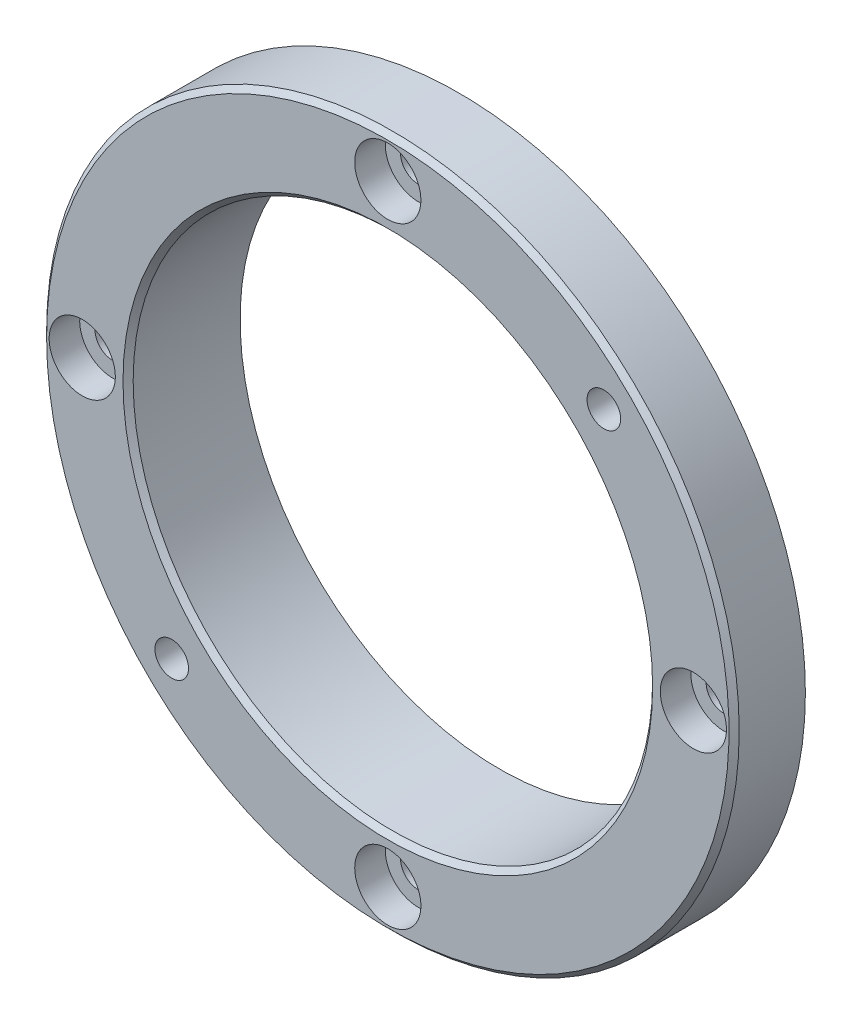
ISO-10303-21;
HEADER;
FILE_DESCRIPTION(('STEP AP214'),'2;1');
FILE_NAME('part.step','',(''),(''),'','','');
FILE_SCHEMA(('AUTOMOTIVE_DESIGN { 1 0 10303 214 1 1 1 1 }'));
ENDSEC;
DATA;
#1=APPLICATION_CONTEXT('core data for automotive mechanical design processes');
#2=APPLICATION_PROTOCOL_DEFINITION('international standard','automotive_design',2000,#1);
#3=PRODUCT_CONTEXT('',#1,'mechanical');
#4=PRODUCT('Part','Part','',(#3));
#5=PRODUCT_RELATED_PRODUCT_CATEGORY('part','',(#4));
#6=PRODUCT_DEFINITION_FORMATION('','',#4);
#7=PRODUCT_DEFINITION_CONTEXT('part definition',#1,'design');
#8=PRODUCT_DEFINITION('design','',#6,#7);
#9=PRODUCT_DEFINITION_SHAPE('','',#8);
#10=(LENGTH_UNIT() NAMED_UNIT(*) SI_UNIT(.MILLI.,.METRE.));
#11=(NAMED_UNIT(*) PLANE_ANGLE_UNIT() SI_UNIT($,.RADIAN.));
#12=(NAMED_UNIT(*) SI_UNIT($,.STERADIAN.) SOLID_ANGLE_UNIT());
#13=UNCERTAINTY_MEASURE_WITH_UNIT(LENGTH_MEASURE(1.E-05),#10,'distance_accuracy_value','');
#14=(GEOMETRIC_REPRESENTATION_CONTEXT(3) GLOBAL_UNCERTAINTY_ASSIGNED_CONTEXT((#13)) GLOBAL_UNIT_ASSIGNED_CONTEXT((#10,
#11,#12)) REPRESENTATION_CONTEXT('',''));
#15=CARTESIAN_POINT('',(0.,0.,0.));
#16=DIRECTION('',(0.,0.,1.));
#17=DIRECTION('',(1.,0.,0.));
#18=AXIS2_PLACEMENT_3D('',#15,#16,#17);
#19=CARTESIAN_POINT('',(0.,0.,0.));
#20=DIRECTION('',(0.,0.,1.));
#21=DIRECTION('',(1.,0.,0.));
#22=AXIS2_PLACEMENT_3D('',#19,#20,#21);
#23=CYLINDRICAL_SURFACE('',#22,27.);
#24=CARTESIAN_POINT('',(0.,0.,-10.5));
#25=DIRECTION('',(0.,0.,1.));
#26=DIRECTION('',(1.,0.,0.));
#27=AXIS2_PLACEMENT_3D('',#24,#25,#26);
#28=CIRCLE('',#27,27.);
#29=CARTESIAN_POINT('',(27.,0.,-10.5));
#30=VERTEX_POINT('',#29);
#31=EDGE_CURVE('E51',#30,#30,#28,.T.);
#32=ORIENTED_EDGE('',*,*,#31,.T.);
#33=EDGE_LOOP('',(#32));
#34=FACE_BOUND('',#33,.T.);
#35=CARTESIAN_POINT('',(0.,0.,-7.));
#36=DIRECTION('',(0.,0.,1.));
#37=DIRECTION('',(1.,0.,0.));
#38=AXIS2_PLACEMENT_3D('',#35,#36,#37);
#39=CIRCLE('',#38,27.);
#40=CARTESIAN_POINT('',(27.,0.,-7.));
#41=VERTEX_POINT('',#40);
#42=EDGE_CURVE('E60',#41,#41,#39,.T.);
#43=ORIENTED_EDGE('',*,*,#42,.F.);
#44=EDGE_LOOP('',(#43));
#45=FACE_BOUND('',#44,.T.);
#46=ADVANCED_FACE('F28',(#34,#45),#23,.T.);
#47=CARTESIAN_POINT('',(0.,27.,-11.));
#48=DIRECTION('',(0.,0.,1.));
#49=DIRECTION('',(1.,0.,0.));
#50=AXIS2_PLACEMENT_3D('',#47,#48,#49);
#51=PLANE('',#50);
#52=CARTESIAN_POINT('',(0.,0.,-11.));
#53=DIRECTION('',(0.,0.,1.));
#54=DIRECTION('',(1.,0.,0.));
#55=AXIS2_PLACEMENT_3D('',#52,#53,#54);
#56=CIRCLE('',#55,26.5);
#57=CARTESIAN_POINT('',(26.5,0.,-11.));
#58=VERTEX_POINT('',#57);
#59=EDGE_CURVE('E48',#58,#58,#56,.F.);
#60=ORIENTED_EDGE('',*,*,#59,.T.);
#61=EDGE_LOOP('',(#60));
#62=FACE_BOUND('',#61,.T.);
#63=CARTESIAN_POINT('',(0.,0.,-11.));
#64=DIRECTION('',(0.,0.,1.));
#65=DIRECTION('',(1.,0.,0.));
#66=AXIS2_PLACEMENT_3D('',#63,#64,#65);
#67=CIRCLE('',#66,25.5);
#68=CARTESIAN_POINT('',(25.5,0.,-11.));
#69=VERTEX_POINT('',#68);
#70=EDGE_CURVE('E54',#69,#69,#67,.T.);
#71=ORIENTED_EDGE('',*,*,#70,.T.);
#72=EDGE_LOOP('',(#71));
#73=FACE_BOUND('',#72,.T.);
#74=ADVANCED_FACE('F174',(#62,#73),#51,.F.);
#75=CARTESIAN_POINT('',(0.,0.,0.));
#76=DIRECTION('',(0.,0.,1.));
#77=DIRECTION('',(1.,0.,0.));
#78=AXIS2_PLACEMENT_3D('',#75,#76,#77);
#79=CYLINDRICAL_SURFACE('',#78,25.5);
#80=CARTESIAN_POINT('',(0.,0.,-0.500000000000018));
#81=DIRECTION('',(0.,0.,-1.));
#82=DIRECTION('',(-1.,0.,0.));
#83=AXIS2_PLACEMENT_3D('',#80,#81,#82);
#84=CIRCLE('',#83,25.5);
#85=CARTESIAN_POINT('',(-25.5,0.,-0.500000000000018));
#86=VERTEX_POINT('',#85);
#87=EDGE_CURVE('E43',#86,#86,#84,.F.);
#88=ORIENTED_EDGE('',*,*,#87,.T.);
#89=EDGE_LOOP('',(#88));
#90=FACE_BOUND('',#89,.T.);
#91=ORIENTED_EDGE('',*,*,#70,.F.);
#92=EDGE_LOOP('',(#91));
#93=FACE_BOUND('',#92,.T.);
#94=ADVANCED_FACE('F145',(#90,#93),#79,.F.);
#95=CARTESIAN_POINT('',(0.,25.5,0.));
#96=DIRECTION('',(0.,0.,-1.));
#97=DIRECTION('',(-1.,0.,0.));
#98=AXIS2_PLACEMENT_3D('',#95,#96,#97);
#99=PLANE('',#98);
#100=CARTESIAN_POINT('',(0.,0.,0.));
#101=DIRECTION('',(0.,0.,-1.));
#102=DIRECTION('',(-1.,0.,0.));
#103=AXIS2_PLACEMENT_3D('',#100,#101,#102);
#104=CIRCLE('',#103,26.);
#105=CARTESIAN_POINT('',(-26.,0.,0.));
#106=VERTEX_POINT('',#105);
#107=EDGE_CURVE('E35',#106,#106,#104,.T.);
#108=ORIENTED_EDGE('',*,*,#107,.T.);
#109=EDGE_LOOP('',(#108));
#110=FACE_BOUND('',#109,.T.);
#111=CARTESIAN_POINT('',(0.,0.,0.));
#112=DIRECTION('',(0.,0.,-1.));
#113=DIRECTION('',(-1.,0.,0.));
#114=AXIS2_PLACEMENT_3D('',#111,#112,#113);
#115=CIRCLE('',#114,33.5);
#116=CARTESIAN_POINT('',(-33.5,0.,0.));
#117=VERTEX_POINT('',#116);
#118=EDGE_CURVE('E39',#117,#117,#115,.F.);
#119=ORIENTED_EDGE('',*,*,#118,.T.);
#120=EDGE_LOOP('',(#119));
#121=FACE_BOUND('',#120,.T.);
#122=CARTESIAN_POINT('',(30.,3.14233502499844E-13,0.));
#123=DIRECTION('',(0.,0.,1.));
#124=DIRECTION('',(0.,-1.,0.));
#125=AXIS2_PLACEMENT_3D('',#122,#123,#124);
#126=CIRCLE('',#125,3.25);
#127=CARTESIAN_POINT('',(30.,-3.24999999999969,0.));
#128=VERTEX_POINT('',#127);
#129=EDGE_CURVE('E100',#128,#128,#126,.T.);
#130=ORIENTED_EDGE('',*,*,#129,.F.);
#131=EDGE_LOOP('',(#130));
#132=FACE_BOUND('',#131,.T.);
#133=CARTESIAN_POINT('',(2.09489001666563E-13,-30.,0.));
#134=DIRECTION('',(0.,0.,1.));
#135=DIRECTION('',(-1.,0.,0.));
#136=AXIS2_PLACEMENT_3D('',#133,#134,#135);
#137=CIRCLE('',#136,3.25);
#138=CARTESIAN_POINT('',(-3.24999999999979,-30.,0.));
#139=VERTEX_POINT('',#138);
#140=EDGE_CURVE('E94',#139,#139,#137,.T.);
#141=ORIENTED_EDGE('',*,*,#140,.F.);
#142=EDGE_LOOP('',(#141));
#143=FACE_BOUND('',#142,.T.);
#144=CARTESIAN_POINT('',(-30.,-1.04744500833281E-13,0.));
#145=DIRECTION('',(0.,0.,1.));
#146=DIRECTION('',(0.,1.,0.));
#147=AXIS2_PLACEMENT_3D('',#144,#145,#146);
#148=CIRCLE('',#147,3.25);
#149=CARTESIAN_POINT('',(-30.,3.24999999999989,0.));
#150=VERTEX_POINT('',#149);
#151=EDGE_CURVE('E88',#150,#150,#148,.T.);
#152=ORIENTED_EDGE('',*,*,#151,.F.);
#153=EDGE_LOOP('',(#152));
#154=FACE_BOUND('',#153,.T.);
#155=CARTESIAN_POINT('',(0.,30.,0.));
#156=DIRECTION('',(0.,0.,1.));
#157=DIRECTION('',(1.,0.,0.));
#158=AXIS2_PLACEMENT_3D('',#155,#156,#157);
#159=CIRCLE('',#158,3.25);
#160=CARTESIAN_POINT('',(3.25,30.,0.));
#161=VERTEX_POINT('',#160);
#162=EDGE_CURVE('E76',#161,#161,#159,.T.);
#163=ORIENTED_EDGE('',*,*,#162,.F.);
#164=EDGE_LOOP('',(#163));
#165=FACE_BOUND('',#164,.T.);
#166=CARTESIAN_POINT('',(21.2132034355965,21.2132034355963,0.));
#167=DIRECTION('',(0.,0.,1.));
#168=DIRECTION('',(1.,0.,0.));
#169=AXIS2_PLACEMENT_3D('',#166,#167,#168);
#170=CIRCLE('',#169,1.64999999999999);
#171=CARTESIAN_POINT('',(22.8632034355965,21.2132034355963,0.));
#172=VERTEX_POINT('',#171);
#173=EDGE_CURVE('E72',#172,#172,#170,.T.);
#174=ORIENTED_EDGE('',*,*,#173,.F.);
#175=EDGE_LOOP('',(#174));
#176=FACE_BOUND('',#175,.T.);
#177=CARTESIAN_POINT('',(-21.2132034355965,-21.2132034355963,0.));
#178=DIRECTION('',(0.,0.,1.));
#179=DIRECTION('',(1.,0.,0.));
#180=AXIS2_PLACEMENT_3D('',#177,#178,#179);
#181=CIRCLE('',#180,1.64999999999999);
#182=CARTESIAN_POINT('',(-19.5632034355965,-21.2132034355963,0.));
#183=VERTEX_POINT('',#182);
#184=EDGE_CURVE('E66',#183,#183,#181,.T.);
#185=ORIENTED_EDGE('',*,*,#184,.F.);
#186=EDGE_LOOP('',(#185));
#187=FACE_BOUND('',#186,.T.);
#188=ADVANCED_FACE('F141',(#110,#121,#132,#143,#154,#165,#176,#187),#99,.F.);
#189=CARTESIAN_POINT('',(0.,0.,0.));
#190=DIRECTION('',(0.,0.,1.));
#191=DIRECTION('',(1.,0.,0.));
#192=AXIS2_PLACEMENT_3D('',#189,#190,#191);
#193=CYLINDRICAL_SURFACE('',#192,34.);
#194=CARTESIAN_POINT('',(0.,0.,-0.500000000000008));
#195=DIRECTION('',(0.,0.,-1.));
#196=DIRECTION('',(-1.,0.,0.));
#197=AXIS2_PLACEMENT_3D('',#194,#195,#196);
#198=CIRCLE('',#197,34.);
#199=CARTESIAN_POINT('',(-34.,0.,-0.500000000000008));
#200=VERTEX_POINT('',#199);
#201=EDGE_CURVE('E10',#200,#200,#198,.T.);
#202=ORIENTED_EDGE('',*,*,#201,.T.);
#203=EDGE_LOOP('',(#202));
#204=FACE_BOUND('',#203,.T.);
#205=CARTESIAN_POINT('',(0.,0.,-7.));
#206=DIRECTION('',(0.,0.,1.));
#207=DIRECTION('',(1.,0.,0.));
#208=AXIS2_PLACEMENT_3D('',#205,#206,#207);
#209=CIRCLE('',#208,34.);
#210=CARTESIAN_POINT('',(34.,0.,-7.));
#211=VERTEX_POINT('',#210);
#212=EDGE_CURVE('E57',#211,#211,#209,.T.);
#213=ORIENTED_EDGE('',*,*,#212,.T.);
#214=EDGE_LOOP('',(#213));
#215=FACE_BOUND('',#214,.T.);
#216=ADVANCED_FACE('F144',(#204,#215),#193,.T.);
#217=CARTESIAN_POINT('',(0.,34.,-7.));
#218=DIRECTION('',(0.,0.,1.));
#219=DIRECTION('',(1.,0.,0.));
#220=AXIS2_PLACEMENT_3D('',#217,#218,#219);
#221=PLANE('',#220);
#222=CARTESIAN_POINT('',(30.,3.14233502499844E-13,-7.));
#223=DIRECTION('',(0.,0.,1.));
#224=DIRECTION('',(1.,0.,0.));
#225=AXIS2_PLACEMENT_3D('',#222,#223,#224);
#226=CIRCLE('',#225,1.75);
#227=CARTESIAN_POINT('',(31.75,3.14233502499844E-13,-7.));
#228=VERTEX_POINT('',#227);
#229=EDGE_CURVE('E117',#228,#228,#226,.T.);
#230=ORIENTED_EDGE('',*,*,#229,.T.);
#231=EDGE_LOOP('',(#230));
#232=FACE_BOUND('',#231,.T.);
#233=CARTESIAN_POINT('',(2.09489001666563E-13,-30.,-7.));
#234=DIRECTION('',(0.,0.,1.));
#235=DIRECTION('',(1.,0.,0.));
#236=AXIS2_PLACEMENT_3D('',#233,#234,#235);
#237=CIRCLE('',#236,1.75);
#238=CARTESIAN_POINT('',(1.75000000000021,-30.,-7.));
#239=VERTEX_POINT('',#238);
#240=EDGE_CURVE('E111',#239,#239,#237,.T.);
#241=ORIENTED_EDGE('',*,*,#240,.T.);
#242=EDGE_LOOP('',(#241));
#243=FACE_BOUND('',#242,.T.);
#244=CARTESIAN_POINT('',(-30.,-1.04744500833281E-13,-7.));
#245=DIRECTION('',(0.,0.,1.));
#246=DIRECTION('',(1.,0.,0.));
#247=AXIS2_PLACEMENT_3D('',#244,#245,#246);
#248=CIRCLE('',#247,1.75);
#249=CARTESIAN_POINT('',(-28.25,-1.04744500833281E-13,-7.));
#250=VERTEX_POINT('',#249);
#251=EDGE_CURVE('E103',#250,#250,#248,.T.);
#252=ORIENTED_EDGE('',*,*,#251,.T.);
#253=EDGE_LOOP('',(#252));
#254=FACE_BOUND('',#253,.T.);
#255=CARTESIAN_POINT('',(0.,30.,-7.));
#256=DIRECTION('',(0.,0.,1.));
#257=DIRECTION('',(1.,0.,0.));
#258=AXIS2_PLACEMENT_3D('',#255,#256,#257);
#259=CIRCLE('',#258,1.75);
#260=CARTESIAN_POINT('',(1.75,30.,-7.));
#261=VERTEX_POINT('',#260);
#262=EDGE_CURVE('E79',#261,#261,#259,.T.);
#263=ORIENTED_EDGE('',*,*,#262,.T.);
#264=EDGE_LOOP('',(#263));
#265=FACE_BOUND('',#264,.T.);
#266=CARTESIAN_POINT('',(21.2132034355965,21.2132034355963,-7.));
#267=DIRECTION('',(0.,0.,1.));
#268=DIRECTION('',(1.,0.,0.));
#269=AXIS2_PLACEMENT_3D('',#266,#267,#268);
#270=CIRCLE('',#269,1.64999999999999);
#271=CARTESIAN_POINT('',(22.8632034355965,21.2132034355963,-7.));
#272=VERTEX_POINT('',#271);
#273=EDGE_CURVE('E69',#272,#272,#270,.T.);
#274=ORIENTED_EDGE('',*,*,#273,.T.);
#275=EDGE_LOOP('',(#274));
#276=FACE_BOUND('',#275,.T.);
#277=CARTESIAN_POINT('',(-21.2132034355965,-21.2132034355963,-7.));
#278=DIRECTION('',(0.,0.,1.));
#279=DIRECTION('',(1.,0.,0.));
#280=AXIS2_PLACEMENT_3D('',#277,#278,#279);
#281=CIRCLE('',#280,1.64999999999999);
#282=CARTESIAN_POINT('',(-19.5632034355965,-21.2132034355963,-7.));
#283=VERTEX_POINT('',#282);
#284=EDGE_CURVE('E63',#283,#283,#281,.T.);
#285=ORIENTED_EDGE('',*,*,#284,.T.);
#286=EDGE_LOOP('',(#285));
#287=FACE_BOUND('',#286,.T.);
#288=ORIENTED_EDGE('',*,*,#212,.F.);
#289=EDGE_LOOP('',(#288));
#290=FACE_BOUND('',#289,.T.);
#291=ORIENTED_EDGE('',*,*,#42,.T.);
#292=EDGE_LOOP('',(#291));
#293=FACE_BOUND('',#292,.T.);
#294=ADVANCED_FACE('F160',(#232,#243,#254,#265,#276,#287,#290,#293),#221,.F.);
#295=CARTESIAN_POINT('',(-21.2132034355965,-21.2132034355963,0.));
#296=DIRECTION('',(0.,0.,1.));
#297=DIRECTION('',(1.,0.,0.));
#298=AXIS2_PLACEMENT_3D('',#295,#296,#297);
#299=CYLINDRICAL_SURFACE('',#298,1.64999999999999);
#300=ORIENTED_EDGE('',*,*,#284,.F.);
#301=EDGE_LOOP('',(#300));
#302=FACE_BOUND('',#301,.T.);
#303=ORIENTED_EDGE('',*,*,#184,.T.);
#304=EDGE_LOOP('',(#303));
#305=FACE_BOUND('',#304,.T.);
#306=ADVANCED_FACE('F157',(#302,#305),#299,.F.);
#307=CARTESIAN_POINT('',(21.2132034355965,21.2132034355963,0.));
#308=DIRECTION('',(0.,0.,1.));
#309=DIRECTION('',(1.,0.,0.));
#310=AXIS2_PLACEMENT_3D('',#307,#308,#309);
#311=CYLINDRICAL_SURFACE('',#310,1.64999999999999);
#312=ORIENTED_EDGE('',*,*,#273,.F.);
#313=EDGE_LOOP('',(#312));
#314=FACE_BOUND('',#313,.T.);
#315=ORIENTED_EDGE('',*,*,#173,.T.);
#316=EDGE_LOOP('',(#315));
#317=FACE_BOUND('',#316,.T.);
#318=ADVANCED_FACE('F159',(#314,#317),#311,.F.);
#319=CARTESIAN_POINT('',(0.,30.,-3.));
#320=DIRECTION('',(0.,0.,1.));
#321=DIRECTION('',(1.,0.,0.));
#322=AXIS2_PLACEMENT_3D('',#319,#320,#321);
#323=CYLINDRICAL_SURFACE('',#322,3.25);
#324=CARTESIAN_POINT('',(0.,30.,-3.));
#325=DIRECTION('',(0.,0.,1.));
#326=DIRECTION('',(1.,0.,0.));
#327=AXIS2_PLACEMENT_3D('',#324,#325,#326);
#328=CIRCLE('',#327,3.25);
#329=CARTESIAN_POINT('',(3.25,30.,-3.));
#330=VERTEX_POINT('',#329);
#331=EDGE_CURVE('E75',#330,#330,#328,.T.);
#332=ORIENTED_EDGE('',*,*,#331,.F.);
#333=EDGE_LOOP('',(#332));
#334=FACE_BOUND('',#333,.T.);
#335=ORIENTED_EDGE('',*,*,#162,.T.);
#336=EDGE_LOOP('',(#335));
#337=FACE_BOUND('',#336,.T.);
#338=ADVANCED_FACE('F167',(#334,#337),#323,.F.);
#339=CARTESIAN_POINT('',(0.,30.,-3.));
#340=DIRECTION('',(0.,0.,1.));
#341=DIRECTION('',(1.,0.,0.));
#342=AXIS2_PLACEMENT_3D('',#339,#340,#341);
#343=PLANE('',#342);
#344=CARTESIAN_POINT('',(0.,30.,-3.));
#345=DIRECTION('',(0.,0.,1.));
#346=DIRECTION('',(1.,0.,0.));
#347=AXIS2_PLACEMENT_3D('',#344,#345,#346);
#348=CIRCLE('',#347,1.75);
#349=CARTESIAN_POINT('',(1.75,30.,-3.));
#350=VERTEX_POINT('',#349);
#351=EDGE_CURVE('E84',#350,#350,#348,.T.);
#352=ORIENTED_EDGE('',*,*,#351,.F.);
#353=EDGE_LOOP('',(#352));
#354=FACE_BOUND('',#353,.T.);
#355=ORIENTED_EDGE('',*,*,#331,.T.);
#356=EDGE_LOOP('',(#355));
#357=FACE_BOUND('',#356,.T.);
#358=ADVANCED_FACE('F346',(#354,#357),#343,.T.);
#359=CARTESIAN_POINT('',(0.,30.,-11.));
#360=DIRECTION('',(0.,0.,1.));
#361=DIRECTION('',(1.,0.,0.));
#362=AXIS2_PLACEMENT_3D('',#359,#360,#361);
#363=CYLINDRICAL_SURFACE('',#362,1.75);
#364=ORIENTED_EDGE('',*,*,#351,.T.);
#365=EDGE_LOOP('',(#364));
#366=FACE_BOUND('',#365,.T.);
#367=ORIENTED_EDGE('',*,*,#262,.F.);
#368=EDGE_LOOP('',(#367));
#369=FACE_BOUND('',#368,.T.);
#370=ADVANCED_FACE('F227',(#366,#369),#363,.F.);
#371=CARTESIAN_POINT('',(-30.,-1.04744500833281E-13,-3.));
#372=DIRECTION('',(0.,0.,1.));
#373=DIRECTION('',(1.,0.,0.));
#374=AXIS2_PLACEMENT_3D('',#371,#372,#373);
#375=CYLINDRICAL_SURFACE('',#374,3.25);
#376=CARTESIAN_POINT('',(-30.,-1.04744500833281E-13,-3.));
#377=DIRECTION('',(0.,0.,1.));
#378=DIRECTION('',(0.,1.,0.));
#379=AXIS2_PLACEMENT_3D('',#376,#377,#378);
#380=CIRCLE('',#379,3.25);
#381=CARTESIAN_POINT('',(-30.,3.24999999999989,-3.));
#382=VERTEX_POINT('',#381);
#383=EDGE_CURVE('E87',#382,#382,#380,.T.);
#384=ORIENTED_EDGE('',*,*,#383,.F.);
#385=EDGE_LOOP('',(#384));
#386=FACE_BOUND('',#385,.T.);
#387=ORIENTED_EDGE('',*,*,#151,.T.);
#388=EDGE_LOOP('',(#387));
#389=FACE_BOUND('',#388,.T.);
#390=ADVANCED_FACE('F232',(#386,#389),#375,.F.);
#391=CARTESIAN_POINT('',(-30.,-1.04744500833281E-13,-3.));
#392=DIRECTION('',(0.,0.,1.));
#393=DIRECTION('',(0.,1.,0.));
#394=AXIS2_PLACEMENT_3D('',#391,#392,#393);
#395=PLANE('',#394);
#396=CARTESIAN_POINT('',(-30.,-1.04744500833281E-13,-3.));
#397=DIRECTION('',(0.,0.,1.));
#398=DIRECTION('',(0.,1.,0.));
#399=AXIS2_PLACEMENT_3D('',#396,#397,#398);
#400=CIRCLE('',#399,1.75);
#401=CARTESIAN_POINT('',(-30.,1.7499999999999,-3.));
#402=VERTEX_POINT('',#401);
#403=EDGE_CURVE('E108',#402,#402,#400,.T.);
#404=ORIENTED_EDGE('',*,*,#403,.F.);
#405=EDGE_LOOP('',(#404));
#406=FACE_BOUND('',#405,.T.);
#407=ORIENTED_EDGE('',*,*,#383,.T.);
#408=EDGE_LOOP('',(#407));
#409=FACE_BOUND('',#408,.T.);
#410=ADVANCED_FACE('F237',(#406,#409),#395,.T.);
#411=CARTESIAN_POINT('',(2.09489001666563E-13,-30.,-3.));
#412=DIRECTION('',(0.,0.,1.));
#413=DIRECTION('',(1.,0.,0.));
#414=AXIS2_PLACEMENT_3D('',#411,#412,#413);
#415=CYLINDRICAL_SURFACE('',#414,3.25);
#416=CARTESIAN_POINT('',(2.09489001666563E-13,-30.,-3.));
#417=DIRECTION('',(0.,0.,1.));
#418=DIRECTION('',(-1.,0.,0.));
#419=AXIS2_PLACEMENT_3D('',#416,#417,#418);
#420=CIRCLE('',#419,3.25);
#421=CARTESIAN_POINT('',(-3.24999999999979,-30.,-3.));
#422=VERTEX_POINT('',#421);
#423=EDGE_CURVE('E91',#422,#422,#420,.T.);
#424=ORIENTED_EDGE('',*,*,#423,.F.);
#425=EDGE_LOOP('',(#424));
#426=FACE_BOUND('',#425,.T.);
#427=ORIENTED_EDGE('',*,*,#140,.T.);
#428=EDGE_LOOP('',(#427));
#429=FACE_BOUND('',#428,.T.);
#430=ADVANCED_FACE('F247',(#426,#429),#415,.F.);
#431=CARTESIAN_POINT('',(2.09489001666563E-13,-30.,-3.));
#432=DIRECTION('',(0.,0.,1.));
#433=DIRECTION('',(-1.,0.,0.));
#434=AXIS2_PLACEMENT_3D('',#431,#432,#433);
#435=PLANE('',#434);
#436=CARTESIAN_POINT('',(2.09489001666563E-13,-30.,-3.));
#437=DIRECTION('',(0.,0.,1.));
#438=DIRECTION('',(-1.,0.,0.));
#439=AXIS2_PLACEMENT_3D('',#436,#437,#438);
#440=CIRCLE('',#439,1.75);
#441=CARTESIAN_POINT('',(-1.74999999999979,-30.,-3.));
#442=VERTEX_POINT('',#441);
#443=EDGE_CURVE('E114',#442,#442,#440,.T.);
#444=ORIENTED_EDGE('',*,*,#443,.F.);
#445=EDGE_LOOP('',(#444));
#446=FACE_BOUND('',#445,.T.);
#447=ORIENTED_EDGE('',*,*,#423,.T.);
#448=EDGE_LOOP('',(#447));
#449=FACE_BOUND('',#448,.T.);
#450=ADVANCED_FACE('F137',(#446,#449),#435,.T.);
#451=CARTESIAN_POINT('',(30.,3.14233502499844E-13,-3.));
#452=DIRECTION('',(0.,0.,1.));
#453=DIRECTION('',(1.,0.,0.));
#454=AXIS2_PLACEMENT_3D('',#451,#452,#453);
#455=CYLINDRICAL_SURFACE('',#454,3.25);
#456=CARTESIAN_POINT('',(30.,3.14233502499844E-13,-3.));
#457=DIRECTION('',(0.,0.,1.));
#458=DIRECTION('',(0.,-1.,0.));
#459=AXIS2_PLACEMENT_3D('',#456,#457,#458);
#460=CIRCLE('',#459,3.25);
#461=CARTESIAN_POINT('',(30.,-3.24999999999969,-3.));
#462=VERTEX_POINT('',#461);
#463=EDGE_CURVE('E97',#462,#462,#460,.T.);
#464=ORIENTED_EDGE('',*,*,#463,.F.);
#465=EDGE_LOOP('',(#464));
#466=FACE_BOUND('',#465,.T.);
#467=ORIENTED_EDGE('',*,*,#129,.T.);
#468=EDGE_LOOP('',(#467));
#469=FACE_BOUND('',#468,.T.);
#470=ADVANCED_FACE('F131',(#466,#469),#455,.F.);
#471=CARTESIAN_POINT('',(30.,3.14233502499844E-13,-3.));
#472=DIRECTION('',(0.,0.,1.));
#473=DIRECTION('',(0.,-1.,0.));
#474=AXIS2_PLACEMENT_3D('',#471,#472,#473);
#475=PLANE('',#474);
#476=CARTESIAN_POINT('',(30.,3.14233502499844E-13,-3.));
#477=DIRECTION('',(0.,0.,1.));
#478=DIRECTION('',(0.,-1.,0.));
#479=AXIS2_PLACEMENT_3D('',#476,#477,#478);
#480=CIRCLE('',#479,1.75);
#481=CARTESIAN_POINT('',(30.,-1.74999999999969,-3.));
#482=VERTEX_POINT('',#481);
#483=EDGE_CURVE('E120',#482,#482,#480,.T.);
#484=ORIENTED_EDGE('',*,*,#483,.F.);
#485=EDGE_LOOP('',(#484));
#486=FACE_BOUND('',#485,.T.);
#487=ORIENTED_EDGE('',*,*,#463,.T.);
#488=EDGE_LOOP('',(#487));
#489=FACE_BOUND('',#488,.T.);
#490=ADVANCED_FACE('F127',(#486,#489),#475,.T.);
#491=CARTESIAN_POINT('',(-30.,-1.04744500833281E-13,-11.));
#492=DIRECTION('',(0.,0.,1.));
#493=DIRECTION('',(1.,0.,0.));
#494=AXIS2_PLACEMENT_3D('',#491,#492,#493);
#495=CYLINDRICAL_SURFACE('',#494,1.75);
#496=ORIENTED_EDGE('',*,*,#403,.T.);
#497=EDGE_LOOP('',(#496));
#498=FACE_BOUND('',#497,.T.);
#499=ORIENTED_EDGE('',*,*,#251,.F.);
#500=EDGE_LOOP('',(#499));
#501=FACE_BOUND('',#500,.T.);
#502=ADVANCED_FACE('F130',(#498,#501),#495,.F.);
#503=CARTESIAN_POINT('',(2.09489001666563E-13,-30.,-11.));
#504=DIRECTION('',(0.,0.,1.));
#505=DIRECTION('',(1.,0.,0.));
#506=AXIS2_PLACEMENT_3D('',#503,#504,#505);
#507=CYLINDRICAL_SURFACE('',#506,1.75);
#508=ORIENTED_EDGE('',*,*,#443,.T.);
#509=EDGE_LOOP('',(#508));
#510=FACE_BOUND('',#509,.T.);
#511=ORIENTED_EDGE('',*,*,#240,.F.);
#512=EDGE_LOOP('',(#511));
#513=FACE_BOUND('',#512,.T.);
#514=ADVANCED_FACE('F287',(#510,#513),#507,.F.);
#515=CARTESIAN_POINT('',(30.,3.14233502499844E-13,-11.));
#516=DIRECTION('',(0.,0.,1.));
#517=DIRECTION('',(1.,0.,0.));
#518=AXIS2_PLACEMENT_3D('',#515,#516,#517);
#519=CYLINDRICAL_SURFACE('',#518,1.75);
#520=ORIENTED_EDGE('',*,*,#483,.T.);
#521=EDGE_LOOP('',(#520));
#522=FACE_BOUND('',#521,.T.);
#523=ORIENTED_EDGE('',*,*,#229,.F.);
#524=EDGE_LOOP('',(#523));
#525=FACE_BOUND('',#524,.T.);
#526=ADVANCED_FACE('F124',(#522,#525),#519,.F.);
#527=CARTESIAN_POINT('',(0.,0.,-10.5));
#528=DIRECTION('',(0.,0.,1.));
#529=DIRECTION('',(1.,0.,0.));
#530=AXIS2_PLACEMENT_3D('',#527,#528,#529);
#531=CONICAL_SURFACE('',#530,27.,0.785398163397452);
#532=ORIENTED_EDGE('',*,*,#59,.F.);
#533=EDGE_LOOP('',(#532));
#534=FACE_BOUND('',#533,.T.);
#535=ORIENTED_EDGE('',*,*,#31,.F.);
#536=EDGE_LOOP('',(#535));
#537=FACE_BOUND('',#536,.T.);
#538=ADVANCED_FACE('F185',(#534,#537),#531,.T.);
#539=CARTESIAN_POINT('',(0.,0.,-0.500000000000018));
#540=DIRECTION('',(0.,0.,1.));
#541=DIRECTION('',(1.,0.,0.));
#542=AXIS2_PLACEMENT_3D('',#539,#540,#541);
#543=CONICAL_SURFACE('',#542,25.5,0.785398163397445);
#544=ORIENTED_EDGE('',*,*,#107,.F.);
#545=EDGE_LOOP('',(#544));
#546=FACE_BOUND('',#545,.T.);
#547=ORIENTED_EDGE('',*,*,#87,.F.);
#548=EDGE_LOOP('',(#547));
#549=FACE_BOUND('',#548,.T.);
#550=ADVANCED_FACE('F187',(#546,#549),#543,.F.);
#551=CARTESIAN_POINT('',(0.,0.,0.));
#552=DIRECTION('',(0.,0.,-1.));
#553=DIRECTION('',(-1.,0.,0.));
#554=AXIS2_PLACEMENT_3D('',#551,#552,#553);
#555=CONICAL_SURFACE('',#554,33.5,0.785398163397441);
#556=ORIENTED_EDGE('',*,*,#201,.F.);
#557=EDGE_LOOP('',(#556));
#558=FACE_BOUND('',#557,.T.);
#559=ORIENTED_EDGE('',*,*,#118,.F.);
#560=EDGE_LOOP('',(#559));
#561=FACE_BOUND('',#560,.T.);
#562=ADVANCED_FACE('F30',(#558,#561),#555,.T.);
#563=CLOSED_SHELL('',(#46,#74,#94,#188,#216,#294,#306,#318,#338,#358,#370,#390,#410,#430,#450,
#470,#490,#502,#514,#526,#538,#550,#562));
#564=MANIFOLD_SOLID_BREP('B2',#563);
#565=ADVANCED_BREP_SHAPE_REPRESENTATION('',(#18,#564),#14);
#566=SHAPE_DEFINITION_REPRESENTATION(#9,#565);
ENDSEC;
END-ISO-10303-21;
